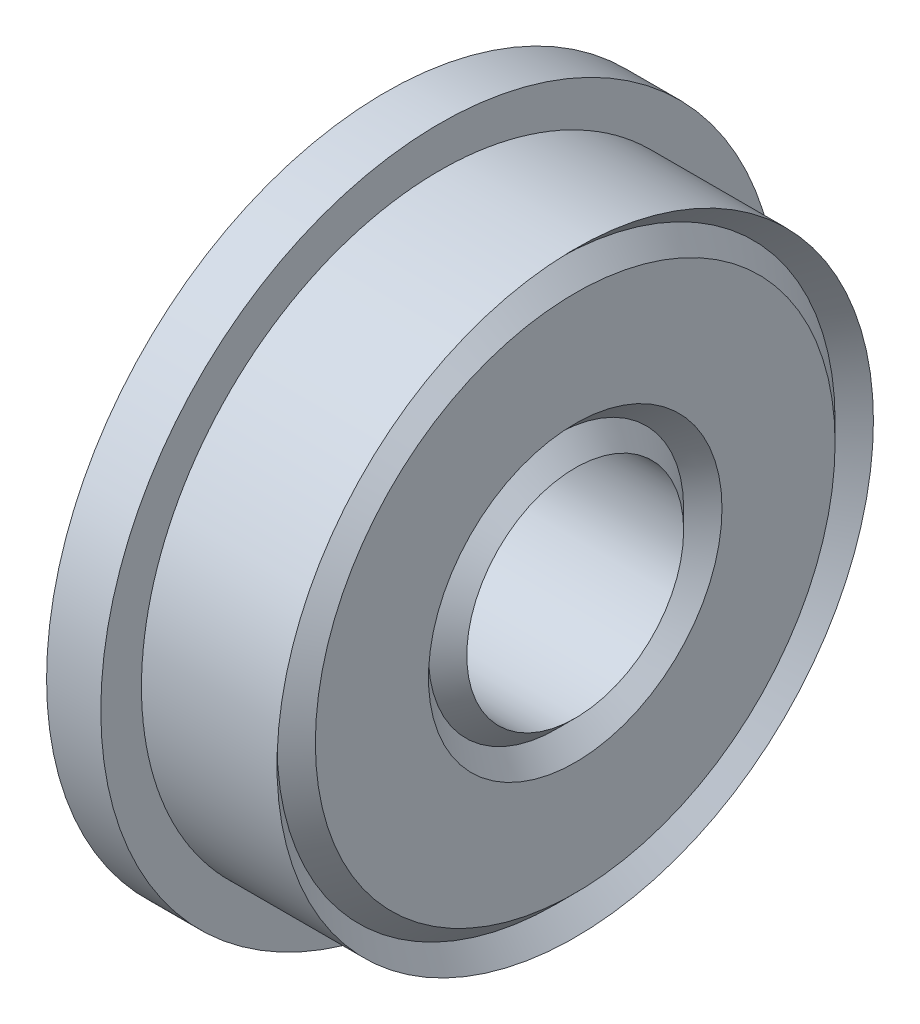
ISO-10303-21;
HEADER;
FILE_DESCRIPTION(('STEP AP214'),'2;1');
FILE_NAME('part.step','',(''),(''),'','','');
FILE_SCHEMA(('AUTOMOTIVE_DESIGN { 1 0 10303 214 1 1 1 1 }'));
ENDSEC;
DATA;
#1=APPLICATION_CONTEXT('core data for automotive mechanical design processes');
#2=APPLICATION_PROTOCOL_DEFINITION('international standard','automotive_design',2000,#1);
#3=PRODUCT_CONTEXT('',#1,'mechanical');
#4=PRODUCT('Part','Part','',(#3));
#5=PRODUCT_RELATED_PRODUCT_CATEGORY('part','',(#4));
#6=PRODUCT_DEFINITION_FORMATION('','',#4);
#7=PRODUCT_DEFINITION_CONTEXT('part definition',#1,'design');
#8=PRODUCT_DEFINITION('design','',#6,#7);
#9=PRODUCT_DEFINITION_SHAPE('','',#8);
#10=(LENGTH_UNIT() NAMED_UNIT(*) SI_UNIT(.MILLI.,.METRE.));
#11=(NAMED_UNIT(*) PLANE_ANGLE_UNIT() SI_UNIT($,.RADIAN.));
#12=(NAMED_UNIT(*) SI_UNIT($,.STERADIAN.) SOLID_ANGLE_UNIT());
#13=UNCERTAINTY_MEASURE_WITH_UNIT(LENGTH_MEASURE(1.E-05),#10,'distance_accuracy_value','');
#14=(GEOMETRIC_REPRESENTATION_CONTEXT(3) GLOBAL_UNCERTAINTY_ASSIGNED_CONTEXT((#13)) GLOBAL_UNIT_ASSIGNED_CONTEXT((#10,
#11,#12)) REPRESENTATION_CONTEXT('',''));
#15=CARTESIAN_POINT('',(0.,0.,0.));
#16=DIRECTION('',(0.,0.,1.));
#17=DIRECTION('',(1.,0.,0.));
#18=AXIS2_PLACEMENT_3D('',#15,#16,#17);
#19=CARTESIAN_POINT('',(-5.,0.,0.));
#20=DIRECTION('',(-1.,0.,0.));
#21=DIRECTION('',(0.,0.,1.));
#22=AXIS2_PLACEMENT_3D('',#19,#20,#21);
#23=CYLINDRICAL_SURFACE('',#22,12.5);
#24=CARTESIAN_POINT('',(-5.,0.,0.));
#25=DIRECTION('',(-1.,0.,0.));
#26=DIRECTION('',(0.,0.,1.));
#27=AXIS2_PLACEMENT_3D('',#24,#25,#26);
#28=CIRCLE('',#27,12.5);
#29=CARTESIAN_POINT('',(-5.,0.,12.5));
#30=VERTEX_POINT('',#29);
#31=EDGE_CURVE('E11',#30,#30,#28,.T.);
#32=ORIENTED_EDGE('',*,*,#31,.T.);
#33=EDGE_LOOP('',(#32));
#34=FACE_BOUND('',#33,.T.);
#35=CARTESIAN_POINT('',(-7.,0.,0.));
#36=DIRECTION('',(-1.,0.,0.));
#37=DIRECTION('',(0.,0.,1.));
#38=AXIS2_PLACEMENT_3D('',#35,#36,#37);
#39=CIRCLE('',#38,12.5);
#40=CARTESIAN_POINT('',(-7.,0.,12.5));
#41=VERTEX_POINT('',#40);
#42=EDGE_CURVE('E48',#41,#41,#39,.T.);
#43=ORIENTED_EDGE('',*,*,#42,.F.);
#44=EDGE_LOOP('',(#43));
#45=FACE_BOUND('',#44,.T.);
#46=ADVANCED_FACE('F45',(#34,#45),#23,.T.);
#47=CARTESIAN_POINT('',(-5.,0.,0.));
#48=DIRECTION('',(-1.,0.,0.));
#49=DIRECTION('',(0.,0.,1.));
#50=AXIS2_PLACEMENT_3D('',#47,#48,#49);
#51=PLANE('',#50);
#52=CARTESIAN_POINT('',(-5.,0.,0.));
#53=DIRECTION('',(-1.,0.,0.));
#54=DIRECTION('',(0.,0.,1.));
#55=AXIS2_PLACEMENT_3D('',#52,#53,#54);
#56=CIRCLE('',#55,11.);
#57=CARTESIAN_POINT('',(-5.,0.,11.));
#58=VERTEX_POINT('',#57);
#59=EDGE_CURVE('E55',#58,#58,#56,.T.);
#60=ORIENTED_EDGE('',*,*,#59,.T.);
#61=EDGE_LOOP('',(#60));
#62=FACE_BOUND('',#61,.T.);
#63=ORIENTED_EDGE('',*,*,#31,.F.);
#64=EDGE_LOOP('',(#63));
#65=FACE_BOUND('',#64,.T.);
#66=ADVANCED_FACE('F63',(#62,#65),#51,.F.);
#67=CARTESIAN_POINT('',(-7.,0.,0.));
#68=DIRECTION('',(-1.,0.,0.));
#69=DIRECTION('',(0.,0.,1.));
#70=AXIS2_PLACEMENT_3D('',#67,#68,#69);
#71=PLANE('',#70);
#72=CARTESIAN_POINT('',(-7.,0.,0.));
#73=DIRECTION('',(-1.,0.,0.));
#74=DIRECTION('',(0.,0.,1.));
#75=AXIS2_PLACEMENT_3D('',#72,#73,#74);
#76=CIRCLE('',#75,11.);
#77=CARTESIAN_POINT('',(-7.,0.,11.));
#78=VERTEX_POINT('',#77);
#79=EDGE_CURVE('E57',#78,#78,#76,.T.);
#80=ORIENTED_EDGE('',*,*,#79,.F.);
#81=EDGE_LOOP('',(#80));
#82=FACE_BOUND('',#81,.T.);
#83=ORIENTED_EDGE('',*,*,#42,.T.);
#84=EDGE_LOOP('',(#83));
#85=FACE_BOUND('',#84,.T.);
#86=ADVANCED_FACE('F69',(#82,#85),#71,.T.);
#87=CARTESIAN_POINT('',(-5.,0.,0.));
#88=DIRECTION('',(-1.,0.,0.));
#89=DIRECTION('',(0.,0.,1.));
#90=AXIS2_PLACEMENT_3D('',#87,#88,#89);
#91=CYLINDRICAL_SURFACE('',#90,11.);
#92=ORIENTED_EDGE('',*,*,#59,.F.);
#93=EDGE_LOOP('',(#92));
#94=FACE_BOUND('',#93,.T.);
#95=ORIENTED_EDGE('',*,*,#79,.T.);
#96=EDGE_LOOP('',(#95));
#97=FACE_BOUND('',#96,.T.);
#98=ADVANCED_FACE('F66',(#94,#97),#91,.F.);
#99=CLOSED_SHELL('',(#46,#66,#86,#98));
#100=MANIFOLD_SOLID_BREP('B2',#99);
#101=CARTESIAN_POINT('',(0.,0.,0.));
#102=DIRECTION('',(1.,0.,0.));
#103=DIRECTION('',(0.,0.,-1.));
#104=AXIS2_PLACEMENT_3D('',#101,#102,#103);
#105=CONICAL_SURFACE('',#104,5.41421356237309,0.785398163397443);
#106=CARTESIAN_POINT('',(-0.707106781186552,0.,0.));
#107=DIRECTION('',(1.,0.,0.));
#108=DIRECTION('',(0.,0.,-1.));
#109=AXIS2_PLACEMENT_3D('',#106,#107,#108);
#110=CIRCLE('',#109,4.70710678118655);
#111=CARTESIAN_POINT('',(-0.707106781186553,0.,-4.70710678118655));
#112=VERTEX_POINT('',#111);
#113=EDGE_CURVE('E44',#112,#112,#110,.T.);
#114=ORIENTED_EDGE('',*,*,#113,.F.);
#115=EDGE_LOOP('',(#114));
#116=FACE_BOUND('',#115,.T.);
#117=CARTESIAN_POINT('',(0.,0.,0.));
#118=DIRECTION('',(1.,0.,0.));
#119=DIRECTION('',(0.,0.,-1.));
#120=AXIS2_PLACEMENT_3D('',#117,#118,#119);
#121=CIRCLE('',#120,5.41421356237309);
#122=CARTESIAN_POINT('',(0.,0.,-5.41421356237309));
#123=VERTEX_POINT('',#122);
#124=EDGE_CURVE('E147',#123,#123,#121,.T.);
#125=ORIENTED_EDGE('',*,*,#124,.T.);
#126=EDGE_LOOP('',(#125));
#127=FACE_BOUND('',#126,.T.);
#128=ADVANCED_FACE('F107',(#116,#127),#105,.F.);
#129=CARTESIAN_POINT('',(-0.707106781186552,0.,0.));
#130=DIRECTION('',(-1.,0.,0.));
#131=DIRECTION('',(0.,0.,1.));
#132=AXIS2_PLACEMENT_3D('',#129,#130,#131);
#133=CONICAL_SURFACE('',#132,4.70710678118655,0.785398163397447);
#134=CARTESIAN_POINT('',(0.,0.,0.));
#135=DIRECTION('',(1.,0.,0.));
#136=DIRECTION('',(0.,0.,-1.));
#137=AXIS2_PLACEMENT_3D('',#134,#135,#136);
#138=CIRCLE('',#137,4.);
#139=CARTESIAN_POINT('',(0.,0.,-4.));
#140=VERTEX_POINT('',#139);
#141=EDGE_CURVE('E113',#140,#140,#138,.T.);
#142=ORIENTED_EDGE('',*,*,#141,.F.);
#143=EDGE_LOOP('',(#142));
#144=FACE_BOUND('',#143,.T.);
#145=ORIENTED_EDGE('',*,*,#113,.T.);
#146=EDGE_LOOP('',(#145));
#147=FACE_BOUND('',#146,.T.);
#148=ADVANCED_FACE('F164',(#144,#147),#133,.T.);
#149=CARTESIAN_POINT('',(0.,0.,0.));
#150=DIRECTION('',(1.,0.,0.));
#151=DIRECTION('',(0.,0.,-1.));
#152=AXIS2_PLACEMENT_3D('',#149,#150,#151);
#153=CYLINDRICAL_SURFACE('',#152,4.);
#154=ORIENTED_EDGE('',*,*,#141,.T.);
#155=EDGE_LOOP('',(#154));
#156=FACE_BOUND('',#155,.T.);
#157=CARTESIAN_POINT('',(-7.,0.,0.));
#158=DIRECTION('',(1.,0.,0.));
#159=DIRECTION('',(0.,0.,-1.));
#160=AXIS2_PLACEMENT_3D('',#157,#158,#159);
#161=CIRCLE('',#160,4.);
#162=CARTESIAN_POINT('',(-7.,0.,-4.));
#163=VERTEX_POINT('',#162);
#164=EDGE_CURVE('E117',#163,#163,#161,.T.);
#165=ORIENTED_EDGE('',*,*,#164,.F.);
#166=EDGE_LOOP('',(#165));
#167=FACE_BOUND('',#166,.T.);
#168=ADVANCED_FACE('F169',(#156,#167),#153,.F.);
#169=CARTESIAN_POINT('',(-6.29289321881345,0.,0.));
#170=DIRECTION('',(1.,0.,0.));
#171=DIRECTION('',(0.,0.,-1.));
#172=AXIS2_PLACEMENT_3D('',#169,#170,#171);
#173=CONICAL_SURFACE('',#172,4.70710678118654,0.785398163397444);
#174=ORIENTED_EDGE('',*,*,#164,.T.);
#175=EDGE_LOOP('',(#174));
#176=FACE_BOUND('',#175,.T.);
#177=CARTESIAN_POINT('',(-6.29289321881345,0.,0.));
#178=DIRECTION('',(1.,0.,0.));
#179=DIRECTION('',(0.,0.,-1.));
#180=AXIS2_PLACEMENT_3D('',#177,#178,#179);
#181=CIRCLE('',#180,4.70710678118654);
#182=CARTESIAN_POINT('',(-6.29289321881345,0.,-4.70710678118654));
#183=VERTEX_POINT('',#182);
#184=EDGE_CURVE('E121',#183,#183,#181,.T.);
#185=ORIENTED_EDGE('',*,*,#184,.F.);
#186=EDGE_LOOP('',(#185));
#187=FACE_BOUND('',#186,.T.);
#188=ADVANCED_FACE('F174',(#176,#187),#173,.T.);
#189=CARTESIAN_POINT('',(-7.,0.,0.));
#190=DIRECTION('',(-1.,0.,0.));
#191=DIRECTION('',(0.,0.,1.));
#192=AXIS2_PLACEMENT_3D('',#189,#190,#191);
#193=CONICAL_SURFACE('',#192,5.41421356237309,0.785398163397448);
#194=ORIENTED_EDGE('',*,*,#184,.T.);
#195=EDGE_LOOP('',(#194));
#196=FACE_BOUND('',#195,.T.);
#197=CARTESIAN_POINT('',(-7.,0.,0.));
#198=DIRECTION('',(1.,0.,0.));
#199=DIRECTION('',(0.,0.,-1.));
#200=AXIS2_PLACEMENT_3D('',#197,#198,#199);
#201=CIRCLE('',#200,5.41421356237309);
#202=CARTESIAN_POINT('',(-7.,0.,-5.41421356237309));
#203=VERTEX_POINT('',#202);
#204=EDGE_CURVE('E126',#203,#203,#201,.T.);
#205=ORIENTED_EDGE('',*,*,#204,.F.);
#206=EDGE_LOOP('',(#205));
#207=FACE_BOUND('',#206,.T.);
#208=ADVANCED_FACE('F179',(#196,#207),#193,.F.);
#209=CARTESIAN_POINT('',(-7.,0.,0.));
#210=DIRECTION('',(1.,0.,0.));
#211=DIRECTION('',(0.,0.,-1.));
#212=AXIS2_PLACEMENT_3D('',#209,#210,#211);
#213=PLANE('',#212);
#214=CARTESIAN_POINT('',(-7.,0.,0.));
#215=DIRECTION('',(1.,0.,0.));
#216=DIRECTION('',(0.,0.,-1.));
#217=AXIS2_PLACEMENT_3D('',#214,#215,#216);
#218=CIRCLE('',#217,9.58578643762691);
#219=CARTESIAN_POINT('',(-7.,0.,-9.58578643762691));
#220=VERTEX_POINT('',#219);
#221=EDGE_CURVE('E129',#220,#220,#218,.T.);
#222=ORIENTED_EDGE('',*,*,#221,.F.);
#223=EDGE_LOOP('',(#222));
#224=FACE_BOUND('',#223,.T.);
#225=ORIENTED_EDGE('',*,*,#204,.T.);
#226=EDGE_LOOP('',(#225));
#227=FACE_BOUND('',#226,.T.);
#228=ADVANCED_FACE('F183',(#224,#227),#213,.F.);
#229=CARTESIAN_POINT('',(-6.29289321881345,0.,0.));
#230=DIRECTION('',(1.,0.,0.));
#231=DIRECTION('',(0.,0.,-1.));
#232=AXIS2_PLACEMENT_3D('',#229,#230,#231);
#233=CONICAL_SURFACE('',#232,10.2928932188135,0.785398163397446);
#234=ORIENTED_EDGE('',*,*,#221,.T.);
#235=EDGE_LOOP('',(#234));
#236=FACE_BOUND('',#235,.T.);
#237=CARTESIAN_POINT('',(-6.29289321881345,0.,0.));
#238=DIRECTION('',(1.,0.,0.));
#239=DIRECTION('',(0.,0.,-1.));
#240=AXIS2_PLACEMENT_3D('',#237,#238,#239);
#241=CIRCLE('',#240,10.2928932188135);
#242=CARTESIAN_POINT('',(-6.29289321881345,0.,-10.2928932188135));
#243=VERTEX_POINT('',#242);
#244=EDGE_CURVE('E132',#243,#243,#241,.T.);
#245=ORIENTED_EDGE('',*,*,#244,.F.);
#246=EDGE_LOOP('',(#245));
#247=FACE_BOUND('',#246,.T.);
#248=ADVANCED_FACE('F187',(#236,#247),#233,.T.);
#249=CARTESIAN_POINT('',(-7.,0.,0.));
#250=DIRECTION('',(-1.,0.,0.));
#251=DIRECTION('',(0.,0.,1.));
#252=AXIS2_PLACEMENT_3D('',#249,#250,#251);
#253=CONICAL_SURFACE('',#252,11.,0.785398163397447);
#254=ORIENTED_EDGE('',*,*,#244,.T.);
#255=EDGE_LOOP('',(#254));
#256=FACE_BOUND('',#255,.T.);
#257=CARTESIAN_POINT('',(-7.,0.,0.));
#258=DIRECTION('',(1.,0.,0.));
#259=DIRECTION('',(0.,0.,-1.));
#260=AXIS2_PLACEMENT_3D('',#257,#258,#259);
#261=CIRCLE('',#260,11.);
#262=CARTESIAN_POINT('',(-7.,0.,-11.));
#263=VERTEX_POINT('',#262);
#264=EDGE_CURVE('E135',#263,#263,#261,.T.);
#265=ORIENTED_EDGE('',*,*,#264,.F.);
#266=EDGE_LOOP('',(#265));
#267=FACE_BOUND('',#266,.T.);
#268=ADVANCED_FACE('F191',(#256,#267),#253,.F.);
#269=CARTESIAN_POINT('',(0.,0.,0.));
#270=DIRECTION('',(1.,0.,0.));
#271=DIRECTION('',(0.,0.,-1.));
#272=AXIS2_PLACEMENT_3D('',#269,#270,#271);
#273=CYLINDRICAL_SURFACE('',#272,11.);
#274=ORIENTED_EDGE('',*,*,#264,.T.);
#275=EDGE_LOOP('',(#274));
#276=FACE_BOUND('',#275,.T.);
#277=CARTESIAN_POINT('',(0.,0.,0.));
#278=DIRECTION('',(1.,0.,0.));
#279=DIRECTION('',(0.,0.,-1.));
#280=AXIS2_PLACEMENT_3D('',#277,#278,#279);
#281=CIRCLE('',#280,11.);
#282=CARTESIAN_POINT('',(0.,0.,-11.));
#283=VERTEX_POINT('',#282);
#284=EDGE_CURVE('E138',#283,#283,#281,.T.);
#285=ORIENTED_EDGE('',*,*,#284,.F.);
#286=EDGE_LOOP('',(#285));
#287=FACE_BOUND('',#286,.T.);
#288=ADVANCED_FACE('F195',(#276,#287),#273,.T.);
#289=CARTESIAN_POINT('',(0.,0.,0.));
#290=DIRECTION('',(1.,0.,0.));
#291=DIRECTION('',(0.,0.,-1.));
#292=AXIS2_PLACEMENT_3D('',#289,#290,#291);
#293=CONICAL_SURFACE('',#292,11.,0.785398163397444);
#294=CARTESIAN_POINT('',(-0.707106781186554,0.,0.));
#295=DIRECTION('',(1.,0.,0.));
#296=DIRECTION('',(0.,0.,-1.));
#297=AXIS2_PLACEMENT_3D('',#294,#295,#296);
#298=CIRCLE('',#297,10.2928932188135);
#299=CARTESIAN_POINT('',(-0.707106781186556,0.,-10.2928932188135));
#300=VERTEX_POINT('',#299);
#301=EDGE_CURVE('E141',#300,#300,#298,.T.);
#302=ORIENTED_EDGE('',*,*,#301,.F.);
#303=EDGE_LOOP('',(#302));
#304=FACE_BOUND('',#303,.T.);
#305=ORIENTED_EDGE('',*,*,#284,.T.);
#306=EDGE_LOOP('',(#305));
#307=FACE_BOUND('',#306,.T.);
#308=ADVANCED_FACE('F160',(#304,#307),#293,.F.);
#309=CARTESIAN_POINT('',(-0.707106781186554,0.,0.));
#310=DIRECTION('',(-1.,0.,0.));
#311=DIRECTION('',(0.,0.,1.));
#312=AXIS2_PLACEMENT_3D('',#309,#310,#311);
#313=CONICAL_SURFACE('',#312,10.2928932188135,0.785398163397454);
#314=CARTESIAN_POINT('',(0.,0.,0.));
#315=DIRECTION('',(1.,0.,0.));
#316=DIRECTION('',(0.,0.,-1.));
#317=AXIS2_PLACEMENT_3D('',#314,#315,#316);
#318=CIRCLE('',#317,9.5857864376269);
#319=CARTESIAN_POINT('',(0.,0.,-9.5857864376269));
#320=VERTEX_POINT('',#319);
#321=EDGE_CURVE('E144',#320,#320,#318,.T.);
#322=ORIENTED_EDGE('',*,*,#321,.F.);
#323=EDGE_LOOP('',(#322));
#324=FACE_BOUND('',#323,.T.);
#325=ORIENTED_EDGE('',*,*,#301,.T.);
#326=EDGE_LOOP('',(#325));
#327=FACE_BOUND('',#326,.T.);
#328=ADVANCED_FACE('F154',(#324,#327),#313,.T.);
#329=CARTESIAN_POINT('',(0.,0.,0.));
#330=DIRECTION('',(1.,0.,0.));
#331=DIRECTION('',(0.,0.,-1.));
#332=AXIS2_PLACEMENT_3D('',#329,#330,#331);
#333=PLANE('',#332);
#334=ORIENTED_EDGE('',*,*,#321,.T.);
#335=EDGE_LOOP('',(#334));
#336=FACE_BOUND('',#335,.T.);
#337=ORIENTED_EDGE('',*,*,#124,.F.);
#338=EDGE_LOOP('',(#337));
#339=FACE_BOUND('',#338,.T.);
#340=ADVANCED_FACE('F152',(#336,#339),#333,.T.);
#341=CLOSED_SHELL('',(#128,#148,#168,#188,#208,#228,#248,#268,#288,#308,#328,#340));
#342=MANIFOLD_SOLID_BREP('B6',#341);
#343=ADVANCED_BREP_SHAPE_REPRESENTATION('',(#18,#100,#342),#14);
#344=SHAPE_DEFINITION_REPRESENTATION(#9,#343);
ENDSEC;
END-ISO-10303-21;
